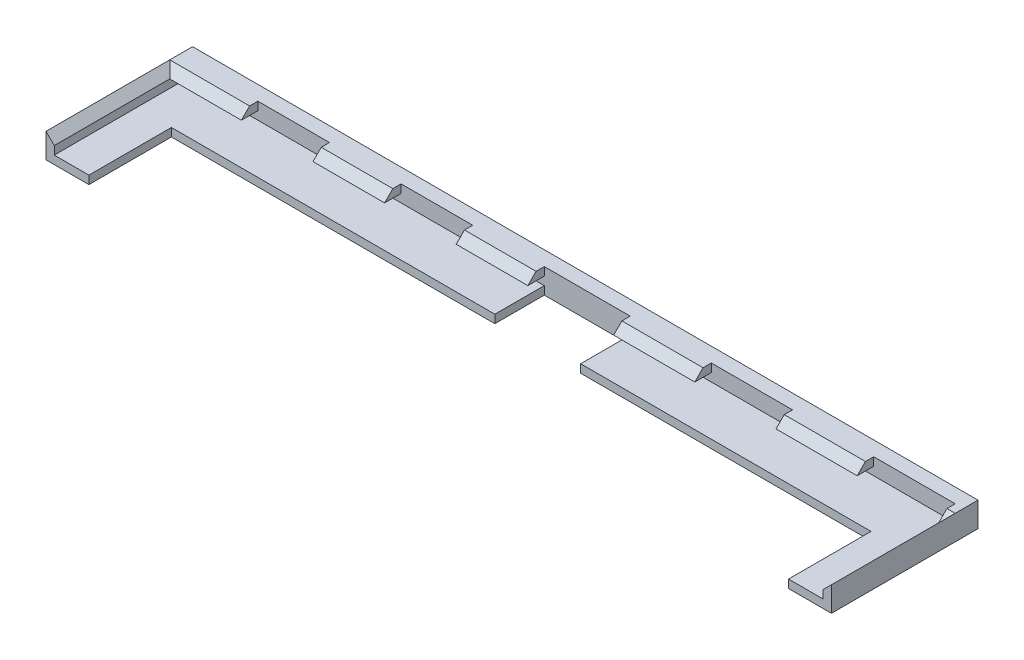
ISO-10303-21;
HEADER;
FILE_DESCRIPTION(('STEP AP214'),'2;1');
FILE_NAME('part.step','',(''),(''),'','','');
FILE_SCHEMA(('AUTOMOTIVE_DESIGN { 1 0 10303 214 1 1 1 1 }'));
ENDSEC;
DATA;
#1=APPLICATION_CONTEXT('core data for automotive mechanical design processes');
#2=APPLICATION_PROTOCOL_DEFINITION('international standard','automotive_design',2000,#1);
#3=PRODUCT_CONTEXT('',#1,'mechanical');
#4=PRODUCT('Part','Part','',(#3));
#5=PRODUCT_RELATED_PRODUCT_CATEGORY('part','',(#4));
#6=PRODUCT_DEFINITION_FORMATION('','',#4);
#7=PRODUCT_DEFINITION_CONTEXT('part definition',#1,'design');
#8=PRODUCT_DEFINITION('design','',#6,#7);
#9=PRODUCT_DEFINITION_SHAPE('','',#8);
#10=(LENGTH_UNIT() NAMED_UNIT(*) SI_UNIT(.MILLI.,.METRE.));
#11=(NAMED_UNIT(*) PLANE_ANGLE_UNIT() SI_UNIT($,.RADIAN.));
#12=(NAMED_UNIT(*) SI_UNIT($,.STERADIAN.) SOLID_ANGLE_UNIT());
#13=UNCERTAINTY_MEASURE_WITH_UNIT(LENGTH_MEASURE(1.E-05),#10,'distance_accuracy_value','');
#14=(GEOMETRIC_REPRESENTATION_CONTEXT(3) GLOBAL_UNCERTAINTY_ASSIGNED_CONTEXT((#13)) GLOBAL_UNIT_ASSIGNED_CONTEXT((#10,
#11,#12)) REPRESENTATION_CONTEXT('',''));
#15=CARTESIAN_POINT('',(0.,0.,0.));
#16=DIRECTION('',(0.,0.,1.));
#17=DIRECTION('',(1.,0.,0.));
#18=AXIS2_PLACEMENT_3D('',#15,#16,#17);
#19=CARTESIAN_POINT('',(21.,2.5,-9.41210666691734));
#20=DIRECTION('',(0.,0.,-1.));
#21=DIRECTION('',(-1.,0.,0.));
#22=AXIS2_PLACEMENT_3D('',#19,#20,#21);
#23=PLANE('',#22);
#24=DIRECTION('',(0.,1.,0.));
#25=VECTOR('',#24,1.);
#26=CARTESIAN_POINT('',(21.,0.,-9.41210666691734));
#27=LINE('',#26,#25);
#28=CARTESIAN_POINT('',(21.,2.5,-9.41210666691734));
#29=VERTEX_POINT('',#28);
#30=CARTESIAN_POINT('',(21.,10.,-9.41210666691734));
#31=VERTEX_POINT('',#30);
#32=EDGE_CURVE('E52',#29,#31,#27,.T.);
#33=ORIENTED_EDGE('',*,*,#32,.T.);
#34=DIRECTION('',(1.,0.,0.));
#35=VECTOR('',#34,1.);
#36=CARTESIAN_POINT('',(0.,10.,-9.41210666691734));
#37=LINE('',#36,#35);
#38=CARTESIAN_POINT('',(259.,10.,-9.41210666691734));
#39=VERTEX_POINT('',#38);
#40=EDGE_CURVE('E46',#31,#39,#37,.T.);
#41=ORIENTED_EDGE('',*,*,#40,.T.);
#42=DIRECTION('',(0.,-1.,0.));
#43=VECTOR('',#42,1.);
#44=CARTESIAN_POINT('',(259.,0.,-9.41210666691734));
#45=LINE('',#44,#43);
#46=CARTESIAN_POINT('',(259.,2.5,-9.41210666691734));
#47=VERTEX_POINT('',#46);
#48=EDGE_CURVE('E552',#39,#47,#45,.T.);
#49=ORIENTED_EDGE('',*,*,#48,.T.);
#50=DIRECTION('',(-1.,0.,0.));
#51=VECTOR('',#50,1.);
#52=CARTESIAN_POINT('',(259.,2.5,-9.41210666691734));
#53=LINE('',#52,#51);
#54=EDGE_CURVE('E11',#47,#29,#53,.T.);
#55=ORIENTED_EDGE('',*,*,#54,.T.);
#56=EDGE_LOOP('',(#33,#41,#49,#55));
#57=FACE_BOUND('',#56,.T.);
#58=ADVANCED_FACE('F43',(#57),#23,.T.);
#59=CARTESIAN_POINT('',(0.,5.,0.));
#60=DIRECTION('',(0.,1.,0.));
#61=DIRECTION('',(0.,0.,1.));
#62=AXIS2_PLACEMENT_3D('',#59,#60,#61);
#63=PLANE('',#62);
#64=DIRECTION('',(0.,0.,1.));
#65=VECTOR('',#64,1.);
#66=CARTESIAN_POINT('',(132.,5.,10.));
#67=LINE('',#66,#65);
#68=CARTESIAN_POINT('',(132.,5.,-5.));
#69=VERTEX_POINT('',#68);
#70=CARTESIAN_POINT('',(132.,5.,10.));
#71=VERTEX_POINT('',#70);
#72=EDGE_CURVE('E510',#69,#71,#67,.T.);
#73=ORIENTED_EDGE('',*,*,#72,.F.);
#74=DIRECTION('',(1.,0.,0.));
#75=VECTOR('',#74,1.);
#76=CARTESIAN_POINT('',(132.,5.,-5.));
#77=LINE('',#76,#75);
#78=CARTESIAN_POINT('',(23.5,5.,-5.));
#79=VERTEX_POINT('',#78);
#80=EDGE_CURVE('E463',#79,#69,#77,.T.);
#81=ORIENTED_EDGE('',*,*,#80,.F.);
#82=DIRECTION('',(0.,0.,1.));
#83=VECTOR('',#82,1.);
#84=CARTESIAN_POINT('',(23.5,5.,35.));
#85=LINE('',#84,#83);
#86=CARTESIAN_POINT('',(23.5,5.,35.));
#87=VERTEX_POINT('',#86);
#88=EDGE_CURVE('E516',#79,#87,#85,.T.);
#89=ORIENTED_EDGE('',*,*,#88,.T.);
#90=DIRECTION('',(-1.,0.,0.));
#91=VECTOR('',#90,1.);
#92=CARTESIAN_POINT('',(0.,5.,35.));
#93=LINE('',#92,#91);
#94=CARTESIAN_POINT('',(34.,5.,35.));
#95=VERTEX_POINT('',#94);
#96=EDGE_CURVE('E488',#95,#87,#93,.T.);
#97=ORIENTED_EDGE('',*,*,#96,.F.);
#98=DIRECTION('',(0.,0.,1.));
#99=VECTOR('',#98,1.);
#100=CARTESIAN_POINT('',(34.,5.,55.));
#101=LINE('',#100,#99);
#102=CARTESIAN_POINT('',(34.,5.,10.));
#103=VERTEX_POINT('',#102);
#104=EDGE_CURVE('E449',#103,#95,#101,.T.);
#105=ORIENTED_EDGE('',*,*,#104,.F.);
#106=DIRECTION('',(-1.,0.,0.));
#107=VECTOR('',#106,1.);
#108=CARTESIAN_POINT('',(34.,5.,10.));
#109=LINE('',#108,#107);
#110=EDGE_CURVE('E445',#71,#103,#109,.T.);
#111=ORIENTED_EDGE('',*,*,#110,.F.);
#112=EDGE_LOOP('',(#73,#81,#89,#97,#105,#111));
#113=FACE_BOUND('',#112,.T.);
#114=ADVANCED_FACE('F608',(#113),#63,.T.);
#115=CARTESIAN_POINT('',(23.5,5.,35.));
#116=DIRECTION('',(-1.,0.,0.));
#117=DIRECTION('',(0.,0.,1.));
#118=AXIS2_PLACEMENT_3D('',#115,#116,#117);
#119=PLANE('',#118);
#120=DIRECTION('',(0.,0.,1.));
#121=VECTOR('',#120,1.);
#122=CARTESIAN_POINT('',(23.5,7.5,-5.));
#123=LINE('',#122,#121);
#124=CARTESIAN_POINT('',(23.5,7.5,-5.));
#125=VERTEX_POINT('',#124);
#126=CARTESIAN_POINT('',(23.5,7.5,0.));
#127=VERTEX_POINT('',#126);
#128=EDGE_CURVE('E524',#125,#127,#123,.T.);
#129=ORIENTED_EDGE('',*,*,#128,.T.);
#130=DIRECTION('',(0.,0.,1.));
#131=VECTOR('',#130,1.);
#132=CARTESIAN_POINT('',(23.5,7.49999999999997,35.));
#133=LINE('',#132,#131);
#134=CARTESIAN_POINT('',(23.5,7.49999999999997,35.));
#135=VERTEX_POINT('',#134);
#136=EDGE_CURVE('E410',#127,#135,#133,.T.);
#137=ORIENTED_EDGE('',*,*,#136,.T.);
#138=DIRECTION('',(0.,1.,0.));
#139=VECTOR('',#138,1.);
#140=CARTESIAN_POINT('',(23.5,5.,35.));
#141=LINE('',#140,#139);
#142=EDGE_CURVE('E513',#87,#135,#141,.T.);
#143=ORIENTED_EDGE('',*,*,#142,.F.);
#144=ORIENTED_EDGE('',*,*,#88,.F.);
#145=DIRECTION('',(0.,-1.,0.));
#146=VECTOR('',#145,1.);
#147=CARTESIAN_POINT('',(23.5,5.,-5.));
#148=LINE('',#147,#146);
#149=EDGE_CURVE('E527',#125,#79,#148,.T.);
#150=ORIENTED_EDGE('',*,*,#149,.F.);
#151=EDGE_LOOP('',(#129,#137,#143,#144,#150));
#152=FACE_BOUND('',#151,.T.);
#153=ADVANCED_FACE('F613',(#152),#119,.F.);
#154=CARTESIAN_POINT('',(25.,7.5,-5.));
#155=DIRECTION('',(0.,1.,0.));
#156=DIRECTION('',(0.,0.,1.));
#157=AXIS2_PLACEMENT_3D('',#154,#155,#156);
#158=PLANE('',#157);
#159=DIRECTION('',(-1.,0.,0.));
#160=VECTOR('',#159,1.);
#161=CARTESIAN_POINT('',(25.,7.5,-5.));
#162=LINE('',#161,#160);
#163=CARTESIAN_POINT('',(45.2,7.5,-5.));
#164=VERTEX_POINT('',#163);
#165=EDGE_CURVE('E472',#164,#125,#162,.T.);
#166=ORIENTED_EDGE('',*,*,#165,.F.);
#167=DIRECTION('',(0.,0.,1.));
#168=VECTOR('',#167,1.);
#169=CARTESIAN_POINT('',(45.2,7.5,-5.));
#170=LINE('',#169,#168);
#171=CARTESIAN_POINT('',(45.2,7.49999999999998,0.));
#172=VERTEX_POINT('',#171);
#173=EDGE_CURVE('E369',#164,#172,#170,.T.);
#174=ORIENTED_EDGE('',*,*,#173,.T.);
#175=DIRECTION('',(-1.,0.,0.));
#176=VECTOR('',#175,1.);
#177=CARTESIAN_POINT('',(25.,7.5,0.));
#178=LINE('',#177,#176);
#179=EDGE_CURVE('E478',#172,#127,#178,.T.);
#180=ORIENTED_EDGE('',*,*,#179,.T.);
#181=ORIENTED_EDGE('',*,*,#128,.F.);
#182=EDGE_LOOP('',(#166,#174,#180,#181));
#183=FACE_BOUND('',#182,.T.);
#184=ADVANCED_FACE('F632',(#183),#158,.F.);
#185=CARTESIAN_POINT('',(88.6,7.5,-5.));
#186=VERTEX_POINT('',#185);
#187=CARTESIAN_POINT('',(66.9,7.5,-5.));
#188=VERTEX_POINT('',#187);
#189=EDGE_CURVE('E482',#186,#188,#162,.T.);
#190=ORIENTED_EDGE('',*,*,#189,.F.);
#191=DIRECTION('',(0.,0.,1.));
#192=VECTOR('',#191,1.);
#193=CARTESIAN_POINT('',(88.6,7.5,-5.));
#194=LINE('',#193,#192);
#195=CARTESIAN_POINT('',(88.6,7.49999999999997,0.));
#196=VERTEX_POINT('',#195);
#197=EDGE_CURVE('E353',#186,#196,#194,.T.);
#198=ORIENTED_EDGE('',*,*,#197,.T.);
#199=CARTESIAN_POINT('',(66.9,7.49999999999998,0.));
#200=VERTEX_POINT('',#199);
#201=EDGE_CURVE('E477',#196,#200,#178,.T.);
#202=ORIENTED_EDGE('',*,*,#201,.T.);
#203=DIRECTION('',(0.,0.,-1.));
#204=VECTOR('',#203,1.);
#205=CARTESIAN_POINT('',(66.9,7.5,-5.));
#206=LINE('',#205,#204);
#207=EDGE_CURVE('E364',#200,#188,#206,.T.);
#208=ORIENTED_EDGE('',*,*,#207,.T.);
#209=EDGE_LOOP('',(#190,#198,#202,#208));
#210=FACE_BOUND('',#209,.T.);
#211=ADVANCED_FACE('F642',(#210),#158,.F.);
#212=CARTESIAN_POINT('',(132.,7.5,0.));
#213=VERTEX_POINT('',#212);
#214=CARTESIAN_POINT('',(110.3,7.49999999999997,0.));
#215=VERTEX_POINT('',#214);
#216=EDGE_CURVE('E473',#213,#215,#178,.T.);
#217=ORIENTED_EDGE('',*,*,#216,.T.);
#218=DIRECTION('',(0.,0.,-1.));
#219=VECTOR('',#218,1.);
#220=CARTESIAN_POINT('',(110.3,7.5,-5.));
#221=LINE('',#220,#219);
#222=CARTESIAN_POINT('',(110.3,7.5,-5.));
#223=VERTEX_POINT('',#222);
#224=EDGE_CURVE('E348',#215,#223,#221,.T.);
#225=ORIENTED_EDGE('',*,*,#224,.T.);
#226=CARTESIAN_POINT('',(132.,7.5,-5.));
#227=VERTEX_POINT('',#226);
#228=EDGE_CURVE('E479',#227,#223,#162,.T.);
#229=ORIENTED_EDGE('',*,*,#228,.F.);
#230=DIRECTION('',(0.,0.,1.));
#231=VECTOR('',#230,1.);
#232=CARTESIAN_POINT('',(132.,7.5,-5.));
#233=LINE('',#232,#231);
#234=EDGE_CURVE('E469',#227,#213,#233,.T.);
#235=ORIENTED_EDGE('',*,*,#234,.T.);
#236=EDGE_LOOP('',(#217,#225,#229,#235));
#237=FACE_BOUND('',#236,.T.);
#238=ADVANCED_FACE('F750',(#237),#158,.F.);
#239=CARTESIAN_POINT('',(158.,7.5,-5.));
#240=DIRECTION('',(0.,1.,0.));
#241=DIRECTION('',(0.,0.,1.));
#242=AXIS2_PLACEMENT_3D('',#239,#240,#241);
#243=PLANE('',#242);
#244=DIRECTION('',(-1.,0.,0.));
#245=VECTOR('',#244,1.);
#246=CARTESIAN_POINT('',(158.,7.5,-5.));
#247=LINE('',#246,#245);
#248=CARTESIAN_POINT('',(182.6,7.5,-5.));
#249=VERTEX_POINT('',#248);
#250=CARTESIAN_POINT('',(158.,7.5,-5.));
#251=VERTEX_POINT('',#250);
#252=EDGE_CURVE('E485',#249,#251,#247,.T.);
#253=ORIENTED_EDGE('',*,*,#252,.F.);
#254=DIRECTION('',(0.,0.,1.));
#255=VECTOR('',#254,1.);
#256=CARTESIAN_POINT('',(182.6,7.5,-5.));
#257=LINE('',#256,#255);
#258=CARTESIAN_POINT('',(182.6,7.5,0.));
#259=VERTEX_POINT('',#258);
#260=EDGE_CURVE('E333',#249,#259,#257,.T.);
#261=ORIENTED_EDGE('',*,*,#260,.T.);
#262=DIRECTION('',(-1.,0.,0.));
#263=VECTOR('',#262,1.);
#264=CARTESIAN_POINT('',(158.,7.5,0.));
#265=LINE('',#264,#263);
#266=CARTESIAN_POINT('',(158.,7.5,0.));
#267=VERTEX_POINT('',#266);
#268=EDGE_CURVE('E489',#259,#267,#265,.T.);
#269=ORIENTED_EDGE('',*,*,#268,.T.);
#270=DIRECTION('',(0.,0.,1.));
#271=VECTOR('',#270,1.);
#272=CARTESIAN_POINT('',(158.,7.5,-5.));
#273=LINE('',#272,#271);
#274=EDGE_CURVE('E476',#251,#267,#273,.T.);
#275=ORIENTED_EDGE('',*,*,#274,.F.);
#276=EDGE_LOOP('',(#253,#261,#269,#275));
#277=FACE_BOUND('',#276,.T.);
#278=ADVANCED_FACE('F677',(#277),#243,.F.);
#279=CARTESIAN_POINT('',(231.8,7.5,-5.));
#280=VERTEX_POINT('',#279);
#281=CARTESIAN_POINT('',(207.2,7.5,-5.));
#282=VERTEX_POINT('',#281);
#283=EDGE_CURVE('E490',#280,#282,#247,.T.);
#284=ORIENTED_EDGE('',*,*,#283,.F.);
#285=DIRECTION('',(0.,0.,1.));
#286=VECTOR('',#285,1.);
#287=CARTESIAN_POINT('',(231.8,7.5,-5.));
#288=LINE('',#287,#286);
#289=CARTESIAN_POINT('',(231.8,7.49999999999999,0.));
#290=VERTEX_POINT('',#289);
#291=EDGE_CURVE('E289',#280,#290,#288,.T.);
#292=ORIENTED_EDGE('',*,*,#291,.T.);
#293=CARTESIAN_POINT('',(207.2,7.5,0.));
#294=VERTEX_POINT('',#293);
#295=EDGE_CURVE('E486',#290,#294,#265,.T.);
#296=ORIENTED_EDGE('',*,*,#295,.T.);
#297=DIRECTION('',(0.,0.,-1.));
#298=VECTOR('',#297,1.);
#299=CARTESIAN_POINT('',(207.2,7.5,-5.));
#300=LINE('',#299,#298);
#301=EDGE_CURVE('E328',#294,#282,#300,.T.);
#302=ORIENTED_EDGE('',*,*,#301,.T.);
#303=EDGE_LOOP('',(#284,#292,#296,#302));
#304=FACE_BOUND('',#303,.T.);
#305=ADVANCED_FACE('F687',(#304),#243,.F.);
#306=DIRECTION('',(0.,0.,-1.));
#307=VECTOR('',#306,1.);
#308=CARTESIAN_POINT('',(256.5,5.,35.));
#309=LINE('',#308,#307);
#310=CARTESIAN_POINT('',(256.5,5.,35.));
#311=VERTEX_POINT('',#310);
#312=CARTESIAN_POINT('',(256.5,5.,-5.));
#313=VERTEX_POINT('',#312);
#314=EDGE_CURVE('E522',#311,#313,#309,.T.);
#315=ORIENTED_EDGE('',*,*,#314,.T.);
#316=CARTESIAN_POINT('',(158.,5.,-5.));
#317=VERTEX_POINT('',#316);
#318=EDGE_CURVE('E465',#317,#313,#77,.T.);
#319=ORIENTED_EDGE('',*,*,#318,.F.);
#320=DIRECTION('',(0.,0.,-1.));
#321=VECTOR('',#320,1.);
#322=CARTESIAN_POINT('',(158.,5.,10.));
#323=LINE('',#322,#321);
#324=CARTESIAN_POINT('',(158.,5.,10.));
#325=VERTEX_POINT('',#324);
#326=EDGE_CURVE('E501',#325,#317,#323,.T.);
#327=ORIENTED_EDGE('',*,*,#326,.F.);
#328=CARTESIAN_POINT('',(246.,5.,10.));
#329=VERTEX_POINT('',#328);
#330=EDGE_CURVE('E441',#329,#325,#109,.T.);
#331=ORIENTED_EDGE('',*,*,#330,.F.);
#332=DIRECTION('',(0.,0.,-1.));
#333=VECTOR('',#332,1.);
#334=CARTESIAN_POINT('',(246.,5.,55.));
#335=LINE('',#334,#333);
#336=CARTESIAN_POINT('',(246.,5.,35.));
#337=VERTEX_POINT('',#336);
#338=EDGE_CURVE('E446',#337,#329,#335,.T.);
#339=ORIENTED_EDGE('',*,*,#338,.F.);
#340=EDGE_CURVE('E495',#311,#337,#93,.T.);
#341=ORIENTED_EDGE('',*,*,#340,.F.);
#342=EDGE_LOOP('',(#315,#319,#327,#331,#339,#341));
#343=FACE_BOUND('',#342,.T.);
#344=ADVANCED_FACE('F704',(#343),#63,.T.);
#345=CARTESIAN_POINT('',(0.,10.,-2.5));
#346=DIRECTION('',(0.,-0.707106781186547,-0.707106781186547));
#347=DIRECTION('',(1.,0.,0.));
#348=AXIS2_PLACEMENT_3D('',#345,#346,#347);
#349=PLANE('',#348);
#350=DIRECTION('',(0.,-0.707106781186548,0.707106781186548));
#351=VECTOR('',#350,1.);
#352=CARTESIAN_POINT('',(256.5,10.,-2.5));
#353=LINE('',#352,#351);
#354=CARTESIAN_POINT('',(256.5,7.5,0.));
#355=VERTEX_POINT('',#354);
#356=CARTESIAN_POINT('',(256.5,10.,-2.5));
#357=VERTEX_POINT('',#356);
#358=EDGE_CURVE('E314',#355,#357,#353,.F.);
#359=ORIENTED_EDGE('',*,*,#358,.F.);
#360=DIRECTION('',(0.577350269189626,0.577350269189626,-0.577350269189626));
#361=VECTOR('',#360,1.);
#362=CARTESIAN_POINT('',(244.833333333333,-4.16666666666667,11.6666666666667));
#363=LINE('',#362,#361);
#364=CARTESIAN_POINT('',(259.,10.,-2.5));
#365=VERTEX_POINT('',#364);
#366=EDGE_CURVE('E405',#365,#355,#363,.F.);
#367=ORIENTED_EDGE('',*,*,#366,.F.);
#368=DIRECTION('',(1.,0.,0.));
#369=VECTOR('',#368,1.);
#370=CARTESIAN_POINT('',(0.,10.,-2.5));
#371=LINE('',#370,#369);
#372=EDGE_CURVE('E421',#357,#365,#371,.T.);
#373=ORIENTED_EDGE('',*,*,#372,.F.);
#374=EDGE_LOOP('',(#359,#367,#373));
#375=FACE_BOUND('',#374,.T.);
#376=ADVANCED_FACE('F565',(#375),#349,.F.);
#377=CARTESIAN_POINT('',(256.5,5.,35.));
#378=DIRECTION('',(1.,0.,0.));
#379=DIRECTION('',(0.,0.,-1.));
#380=AXIS2_PLACEMENT_3D('',#377,#378,#379);
#381=PLANE('',#380);
#382=DIRECTION('',(0.,0.,-1.));
#383=VECTOR('',#382,1.);
#384=CARTESIAN_POINT('',(256.5,7.5,35.));
#385=LINE('',#384,#383);
#386=CARTESIAN_POINT('',(256.5,7.5,35.));
#387=VERTEX_POINT('',#386);
#388=EDGE_CURVE('E433',#387,#355,#385,.T.);
#389=ORIENTED_EDGE('',*,*,#388,.T.);
#390=ORIENTED_EDGE('',*,*,#358,.T.);
#391=DIRECTION('',(0.,0.,1.));
#392=VECTOR('',#391,1.);
#393=CARTESIAN_POINT('',(256.5,10.,0.));
#394=LINE('',#393,#392);
#395=CARTESIAN_POINT('',(256.5,10.,-5.));
#396=VERTEX_POINT('',#395);
#397=EDGE_CURVE('E549',#396,#357,#394,.T.);
#398=ORIENTED_EDGE('',*,*,#397,.F.);
#399=DIRECTION('',(0.,1.,0.));
#400=VECTOR('',#399,1.);
#401=CARTESIAN_POINT('',(256.5,5.,-5.));
#402=LINE('',#401,#400);
#403=EDGE_CURVE('E299',#313,#396,#402,.T.);
#404=ORIENTED_EDGE('',*,*,#403,.F.);
#405=ORIENTED_EDGE('',*,*,#314,.F.);
#406=DIRECTION('',(0.,1.,0.));
#407=VECTOR('',#406,1.);
#408=CARTESIAN_POINT('',(256.5,5.,35.));
#409=LINE('',#408,#407);
#410=EDGE_CURVE('E519',#311,#387,#409,.T.);
#411=ORIENTED_EDGE('',*,*,#410,.T.);
#412=EDGE_LOOP('',(#389,#390,#398,#404,#405,#411));
#413=FACE_BOUND('',#412,.T.);
#414=ADVANCED_FACE('F567',(#413),#381,.F.);
#415=CARTESIAN_POINT('',(231.8,-20.2009920439652,0.));
#416=DIRECTION('',(-1.,0.,0.));
#417=DIRECTION('',(0.,0.,1.));
#418=AXIS2_PLACEMENT_3D('',#415,#416,#417);
#419=PLANE('',#418);
#420=DIRECTION('',(0.,1.,0.));
#421=VECTOR('',#420,1.);
#422=CARTESIAN_POINT('',(231.8,-20.2009920439652,-5.));
#423=LINE('',#422,#421);
#424=CARTESIAN_POINT('',(231.8,10.,-5.));
#425=VERTEX_POINT('',#424);
#426=EDGE_CURVE('E282',#280,#425,#423,.T.);
#427=ORIENTED_EDGE('',*,*,#426,.T.);
#428=DIRECTION('',(0.,0.,1.));
#429=VECTOR('',#428,1.);
#430=CARTESIAN_POINT('',(231.8,10.,0.));
#431=LINE('',#430,#429);
#432=CARTESIAN_POINT('',(231.8,10.,-2.5));
#433=VERTEX_POINT('',#432);
#434=EDGE_CURVE('E286',#425,#433,#431,.T.);
#435=ORIENTED_EDGE('',*,*,#434,.T.);
#436=DIRECTION('',(0.,0.707106781186548,-0.707106781186548));
#437=VECTOR('',#436,1.);
#438=CARTESIAN_POINT('',(231.8,10.,-2.5));
#439=LINE('',#438,#437);
#440=EDGE_CURVE('E292',#433,#290,#439,.F.);
#441=ORIENTED_EDGE('',*,*,#440,.T.);
#442=ORIENTED_EDGE('',*,*,#291,.F.);
#443=EDGE_LOOP('',(#427,#435,#441,#442));
#444=FACE_BOUND('',#443,.T.);
#445=ADVANCED_FACE('F284',(#444),#419,.F.);
#446=ORIENTED_EDGE('',*,*,#440,.F.);
#447=CARTESIAN_POINT('',(207.2,10.,-2.5));
#448=VERTEX_POINT('',#447);
#449=EDGE_CURVE('E309',#448,#433,#371,.T.);
#450=ORIENTED_EDGE('',*,*,#449,.F.);
#451=DIRECTION('',(0.,-0.707106781186548,0.707106781186548));
#452=VECTOR('',#451,1.);
#453=CARTESIAN_POINT('',(207.2,10.,-2.5));
#454=LINE('',#453,#452);
#455=EDGE_CURVE('E324',#294,#448,#454,.F.);
#456=ORIENTED_EDGE('',*,*,#455,.F.);
#457=ORIENTED_EDGE('',*,*,#295,.F.);
#458=EDGE_LOOP('',(#446,#450,#456,#457));
#459=FACE_BOUND('',#458,.T.);
#460=ADVANCED_FACE('F684',(#459),#349,.F.);
#461=CARTESIAN_POINT('',(207.2,-20.1029878699728,0.));
#462=DIRECTION('',(1.,0.,0.));
#463=DIRECTION('',(0.,0.,-1.));
#464=AXIS2_PLACEMENT_3D('',#461,#462,#463);
#465=PLANE('',#464);
#466=ORIENTED_EDGE('',*,*,#455,.T.);
#467=DIRECTION('',(0.,0.,1.));
#468=VECTOR('',#467,1.);
#469=CARTESIAN_POINT('',(207.2,10.,0.));
#470=LINE('',#469,#468);
#471=CARTESIAN_POINT('',(207.2,10.,-5.));
#472=VERTEX_POINT('',#471);
#473=EDGE_CURVE('E547',#472,#448,#470,.T.);
#474=ORIENTED_EDGE('',*,*,#473,.F.);
#475=DIRECTION('',(0.,1.,0.));
#476=VECTOR('',#475,1.);
#477=CARTESIAN_POINT('',(207.2,-20.1029878699728,-5.));
#478=LINE('',#477,#476);
#479=EDGE_CURVE('E321',#282,#472,#478,.T.);
#480=ORIENTED_EDGE('',*,*,#479,.F.);
#481=ORIENTED_EDGE('',*,*,#301,.F.);
#482=EDGE_LOOP('',(#466,#474,#480,#481));
#483=FACE_BOUND('',#482,.T.);
#484=ADVANCED_FACE('F689',(#483),#465,.F.);
#485=CARTESIAN_POINT('',(182.6,-20.1029878699728,0.));
#486=DIRECTION('',(-1.,0.,0.));
#487=DIRECTION('',(0.,0.,1.));
#488=AXIS2_PLACEMENT_3D('',#485,#486,#487);
#489=PLANE('',#488);
#490=DIRECTION('',(0.,1.,0.));
#491=VECTOR('',#490,1.);
#492=CARTESIAN_POINT('',(182.6,-20.1029878699728,-5.));
#493=LINE('',#492,#491);
#494=CARTESIAN_POINT('',(182.6,10.,-5.));
#495=VERTEX_POINT('',#494);
#496=EDGE_CURVE('E322',#249,#495,#493,.T.);
#497=ORIENTED_EDGE('',*,*,#496,.T.);
#498=DIRECTION('',(0.,0.,1.));
#499=VECTOR('',#498,1.);
#500=CARTESIAN_POINT('',(182.6,10.,0.));
#501=LINE('',#500,#499);
#502=CARTESIAN_POINT('',(182.6,10.,-2.5));
#503=VERTEX_POINT('',#502);
#504=EDGE_CURVE('E316',#495,#503,#501,.T.);
#505=ORIENTED_EDGE('',*,*,#504,.T.);
#506=DIRECTION('',(0.,0.707106781186548,-0.707106781186548));
#507=VECTOR('',#506,1.);
#508=CARTESIAN_POINT('',(182.6,10.,-2.5));
#509=LINE('',#508,#507);
#510=EDGE_CURVE('E331',#503,#259,#509,.F.);
#511=ORIENTED_EDGE('',*,*,#510,.T.);
#512=ORIENTED_EDGE('',*,*,#260,.F.);
#513=EDGE_LOOP('',(#497,#505,#511,#512));
#514=FACE_BOUND('',#513,.T.);
#515=ADVANCED_FACE('F673',(#514),#489,.F.);
#516=ORIENTED_EDGE('',*,*,#510,.F.);
#517=CARTESIAN_POINT('',(158.,10.,-2.5));
#518=VERTEX_POINT('',#517);
#519=EDGE_CURVE('E422',#518,#503,#371,.T.);
#520=ORIENTED_EDGE('',*,*,#519,.F.);
#521=DIRECTION('',(0.,-0.707106781186548,0.707106781186548));
#522=VECTOR('',#521,1.);
#523=CARTESIAN_POINT('',(158.,10.,-2.5));
#524=LINE('',#523,#522);
#525=EDGE_CURVE('E414',#267,#518,#524,.F.);
#526=ORIENTED_EDGE('',*,*,#525,.F.);
#527=ORIENTED_EDGE('',*,*,#268,.F.);
#528=EDGE_LOOP('',(#516,#520,#526,#527));
#529=FACE_BOUND('',#528,.T.);
#530=ADVANCED_FACE('F670',(#529),#349,.F.);
#531=CARTESIAN_POINT('',(158.,10.,-5.));
#532=DIRECTION('',(1.,0.,0.));
#533=DIRECTION('',(0.,0.,-1.));
#534=AXIS2_PLACEMENT_3D('',#531,#532,#533);
#535=PLANE('',#534);
#536=ORIENTED_EDGE('',*,*,#274,.T.);
#537=ORIENTED_EDGE('',*,*,#525,.T.);
#538=DIRECTION('',(0.,0.,1.));
#539=VECTOR('',#538,1.);
#540=CARTESIAN_POINT('',(158.,10.,-5.));
#541=LINE('',#540,#539);
#542=CARTESIAN_POINT('',(158.,10.,-5.));
#543=VERTEX_POINT('',#542);
#544=EDGE_CURVE('E453',#543,#518,#541,.T.);
#545=ORIENTED_EDGE('',*,*,#544,.F.);
#546=DIRECTION('',(0.,1.,0.));
#547=VECTOR('',#546,1.);
#548=CARTESIAN_POINT('',(158.,10.,-5.));
#549=LINE('',#548,#547);
#550=EDGE_CURVE('E461',#251,#543,#549,.T.);
#551=ORIENTED_EDGE('',*,*,#550,.F.);
#552=EDGE_LOOP('',(#536,#537,#545,#551));
#553=FACE_BOUND('',#552,.T.);
#554=ADVANCED_FACE('F745',(#553),#535,.F.);
#555=CARTESIAN_POINT('',(132.,10.,-5.));
#556=DIRECTION('',(-1.,0.,0.));
#557=DIRECTION('',(0.,0.,1.));
#558=AXIS2_PLACEMENT_3D('',#555,#556,#557);
#559=PLANE('',#558);
#560=DIRECTION('',(0.,0.,1.));
#561=VECTOR('',#560,1.);
#562=CARTESIAN_POINT('',(132.,10.,-5.));
#563=LINE('',#562,#561);
#564=CARTESIAN_POINT('',(132.,10.,-5.));
#565=VERTEX_POINT('',#564);
#566=CARTESIAN_POINT('',(132.,10.,-2.50000000000003));
#567=VERTEX_POINT('',#566);
#568=EDGE_CURVE('E452',#565,#567,#563,.T.);
#569=ORIENTED_EDGE('',*,*,#568,.T.);
#570=DIRECTION('',(0.,0.707106781186548,-0.707106781186548));
#571=VECTOR('',#570,1.);
#572=CARTESIAN_POINT('',(132.,10.,-2.50000000000003));
#573=LINE('',#572,#571);
#574=EDGE_CURVE('E412',#567,#213,#573,.F.);
#575=ORIENTED_EDGE('',*,*,#574,.T.);
#576=ORIENTED_EDGE('',*,*,#234,.F.);
#577=DIRECTION('',(0.,-1.,0.));
#578=VECTOR('',#577,1.);
#579=CARTESIAN_POINT('',(132.,10.,-5.));
#580=LINE('',#579,#578);
#581=EDGE_CURVE('E466',#565,#227,#580,.T.);
#582=ORIENTED_EDGE('',*,*,#581,.F.);
#583=EDGE_LOOP('',(#569,#575,#576,#582));
#584=FACE_BOUND('',#583,.T.);
#585=ADVANCED_FACE('F661',(#584),#559,.F.);
#586=CARTESIAN_POINT('',(0.,10.,-2.50000000000003));
#587=DIRECTION('',(0.,-0.707106781186547,-0.707106781186547));
#588=DIRECTION('',(1.,0.,0.));
#589=AXIS2_PLACEMENT_3D('',#586,#587,#588);
#590=PLANE('',#589);
#591=DIRECTION('',(0.,-0.707106781186548,0.707106781186548));
#592=VECTOR('',#591,1.);
#593=CARTESIAN_POINT('',(110.3,10.,-2.50000000000003));
#594=LINE('',#593,#592);
#595=CARTESIAN_POINT('',(110.3,10.,-2.50000000000003));
#596=VERTEX_POINT('',#595);
#597=EDGE_CURVE('E344',#215,#596,#594,.F.);
#598=ORIENTED_EDGE('',*,*,#597,.F.);
#599=ORIENTED_EDGE('',*,*,#216,.F.);
#600=ORIENTED_EDGE('',*,*,#574,.F.);
#601=DIRECTION('',(1.,0.,0.));
#602=VECTOR('',#601,1.);
#603=CARTESIAN_POINT('',(0.,10.,-2.50000000000003));
#604=LINE('',#603,#602);
#605=EDGE_CURVE('E425',#596,#567,#604,.T.);
#606=ORIENTED_EDGE('',*,*,#605,.F.);
#607=EDGE_LOOP('',(#598,#599,#600,#606));
#608=FACE_BOUND('',#607,.T.);
#609=ADVANCED_FACE('F658',(#608),#590,.F.);
#610=CARTESIAN_POINT('',(110.3,-17.2685877414801,0.));
#611=DIRECTION('',(1.,0.,0.));
#612=DIRECTION('',(0.,0.,-1.));
#613=AXIS2_PLACEMENT_3D('',#610,#611,#612);
#614=PLANE('',#613);
#615=ORIENTED_EDGE('',*,*,#597,.T.);
#616=DIRECTION('',(0.,0.,1.));
#617=VECTOR('',#616,1.);
#618=CARTESIAN_POINT('',(110.3,10.,0.));
#619=LINE('',#618,#617);
#620=CARTESIAN_POINT('',(110.3,10.,-5.));
#621=VERTEX_POINT('',#620);
#622=EDGE_CURVE('E544',#621,#596,#619,.T.);
#623=ORIENTED_EDGE('',*,*,#622,.F.);
#624=DIRECTION('',(0.,1.,0.));
#625=VECTOR('',#624,1.);
#626=CARTESIAN_POINT('',(110.3,-17.2685877414801,-5.));
#627=LINE('',#626,#625);
#628=EDGE_CURVE('E341',#223,#621,#627,.T.);
#629=ORIENTED_EDGE('',*,*,#628,.F.);
#630=ORIENTED_EDGE('',*,*,#224,.F.);
#631=EDGE_LOOP('',(#615,#623,#629,#630));
#632=FACE_BOUND('',#631,.T.);
#633=ADVANCED_FACE('F726',(#632),#614,.F.);
#634=CARTESIAN_POINT('',(88.6,-17.2685877414801,0.));
#635=DIRECTION('',(-1.,0.,0.));
#636=DIRECTION('',(0.,0.,1.));
#637=AXIS2_PLACEMENT_3D('',#634,#635,#636);
#638=PLANE('',#637);
#639=DIRECTION('',(0.,1.,0.));
#640=VECTOR('',#639,1.);
#641=CARTESIAN_POINT('',(88.6,-17.2685877414801,-5.));
#642=LINE('',#641,#640);
#643=CARTESIAN_POINT('',(88.6,10.,-5.));
#644=VERTEX_POINT('',#643);
#645=EDGE_CURVE('E342',#186,#644,#642,.T.);
#646=ORIENTED_EDGE('',*,*,#645,.T.);
#647=DIRECTION('',(0.,0.,1.));
#648=VECTOR('',#647,1.);
#649=CARTESIAN_POINT('',(88.6,10.,0.));
#650=LINE('',#649,#648);
#651=CARTESIAN_POINT('',(88.6,10.,-2.5));
#652=VERTEX_POINT('',#651);
#653=EDGE_CURVE('E336',#644,#652,#650,.T.);
#654=ORIENTED_EDGE('',*,*,#653,.T.);
#655=DIRECTION('',(0.,0.707106781186548,-0.707106781186548));
#656=VECTOR('',#655,1.);
#657=CARTESIAN_POINT('',(88.6,10.,-2.50000000000003));
#658=LINE('',#657,#656);
#659=EDGE_CURVE('E351',#652,#196,#658,.F.);
#660=ORIENTED_EDGE('',*,*,#659,.T.);
#661=ORIENTED_EDGE('',*,*,#197,.F.);
#662=EDGE_LOOP('',(#646,#654,#660,#661));
#663=FACE_BOUND('',#662,.T.);
#664=ADVANCED_FACE('F979',(#663),#638,.F.);
#665=ORIENTED_EDGE('',*,*,#659,.F.);
#666=CARTESIAN_POINT('',(66.9,10.,-2.50000000000003));
#667=VERTEX_POINT('',#666);
#668=EDGE_CURVE('E430',#667,#652,#604,.T.);
#669=ORIENTED_EDGE('',*,*,#668,.F.);
#670=DIRECTION('',(0.,-0.707106781186548,0.707106781186548));
#671=VECTOR('',#670,1.);
#672=CARTESIAN_POINT('',(66.9,10.,-2.50000000000003));
#673=LINE('',#672,#671);
#674=EDGE_CURVE('E360',#200,#667,#673,.F.);
#675=ORIENTED_EDGE('',*,*,#674,.F.);
#676=ORIENTED_EDGE('',*,*,#201,.F.);
#677=EDGE_LOOP('',(#665,#669,#675,#676));
#678=FACE_BOUND('',#677,.T.);
#679=ADVANCED_FACE('F646',(#678),#590,.F.);
#680=CARTESIAN_POINT('',(66.9,-17.2685877414801,0.));
#681=DIRECTION('',(1.,0.,0.));
#682=DIRECTION('',(0.,0.,-1.));
#683=AXIS2_PLACEMENT_3D('',#680,#681,#682);
#684=PLANE('',#683);
#685=ORIENTED_EDGE('',*,*,#674,.T.);
#686=DIRECTION('',(0.,0.,1.));
#687=VECTOR('',#686,1.);
#688=CARTESIAN_POINT('',(66.9,10.,0.));
#689=LINE('',#688,#687);
#690=CARTESIAN_POINT('',(66.9,10.,-5.));
#691=VERTEX_POINT('',#690);
#692=EDGE_CURVE('E535',#691,#667,#689,.T.);
#693=ORIENTED_EDGE('',*,*,#692,.F.);
#694=DIRECTION('',(0.,1.,0.));
#695=VECTOR('',#694,1.);
#696=CARTESIAN_POINT('',(66.9,-17.2685877414801,-5.));
#697=LINE('',#696,#695);
#698=EDGE_CURVE('E356',#188,#691,#697,.T.);
#699=ORIENTED_EDGE('',*,*,#698,.F.);
#700=ORIENTED_EDGE('',*,*,#207,.F.);
#701=EDGE_LOOP('',(#685,#693,#699,#700));
#702=FACE_BOUND('',#701,.T.);
#703=ADVANCED_FACE('F640',(#702),#684,.F.);
#704=CARTESIAN_POINT('',(45.2,-17.2685877414801,0.));
#705=DIRECTION('',(-1.,0.,0.));
#706=DIRECTION('',(0.,0.,1.));
#707=AXIS2_PLACEMENT_3D('',#704,#705,#706);
#708=PLANE('',#707);
#709=DIRECTION('',(0.,1.,0.));
#710=VECTOR('',#709,1.);
#711=CARTESIAN_POINT('',(45.2,-17.2685877414801,-5.));
#712=LINE('',#711,#710);
#713=CARTESIAN_POINT('',(45.2,10.,-5.));
#714=VERTEX_POINT('',#713);
#715=EDGE_CURVE('E357',#164,#714,#712,.T.);
#716=ORIENTED_EDGE('',*,*,#715,.T.);
#717=DIRECTION('',(0.,0.,-1.));
#718=VECTOR('',#717,1.);
#719=CARTESIAN_POINT('',(45.2,10.,0.));
#720=LINE('',#719,#718);
#721=CARTESIAN_POINT('',(45.2,10.,-2.5));
#722=VERTEX_POINT('',#721);
#723=EDGE_CURVE('E541',#722,#714,#720,.T.);
#724=ORIENTED_EDGE('',*,*,#723,.F.);
#725=DIRECTION('',(0.,0.707106781186548,-0.707106781186548));
#726=VECTOR('',#725,1.);
#727=CARTESIAN_POINT('',(45.2,10.,-2.50000000000003));
#728=LINE('',#727,#726);
#729=EDGE_CURVE('E367',#722,#172,#728,.F.);
#730=ORIENTED_EDGE('',*,*,#729,.T.);
#731=ORIENTED_EDGE('',*,*,#173,.F.);
#732=EDGE_LOOP('',(#716,#724,#730,#731));
#733=FACE_BOUND('',#732,.T.);
#734=ADVANCED_FACE('F628',(#733),#708,.F.);
#735=ORIENTED_EDGE('',*,*,#729,.F.);
#736=CARTESIAN_POINT('',(21.,10.,-2.50000000000003));
#737=VERTEX_POINT('',#736);
#738=EDGE_CURVE('E426',#737,#722,#604,.T.);
#739=ORIENTED_EDGE('',*,*,#738,.F.);
#740=DIRECTION('',(-0.577350269189626,0.577350269189626,-0.577350269189626));
#741=VECTOR('',#740,1.);
#742=CARTESIAN_POINT('',(14.,17.,-9.50000000000003));
#743=LINE('',#742,#741);
#744=EDGE_CURVE('E401',#737,#127,#743,.F.);
#745=ORIENTED_EDGE('',*,*,#744,.T.);
#746=ORIENTED_EDGE('',*,*,#179,.F.);
#747=EDGE_LOOP('',(#735,#739,#745,#746));
#748=FACE_BOUND('',#747,.T.);
#749=ADVANCED_FACE('F625',(#748),#590,.F.);
#750=CARTESIAN_POINT('',(256.5,7.5,35.));
#751=DIRECTION('',(0.707106781186547,-0.707106781186547,0.));
#752=DIRECTION('',(0.,0.,-1.));
#753=AXIS2_PLACEMENT_3D('',#750,#751,#752);
#754=PLANE('',#753);
#755=DIRECTION('',(0.707106781186548,0.707106781186548,0.));
#756=VECTOR('',#755,1.);
#757=CARTESIAN_POINT('',(256.5,7.5,35.));
#758=LINE('',#757,#756);
#759=CARTESIAN_POINT('',(259.,10.,35.));
#760=VERTEX_POINT('',#759);
#761=EDGE_CURVE('E416',#760,#387,#758,.F.);
#762=ORIENTED_EDGE('',*,*,#761,.F.);
#763=DIRECTION('',(0.,0.,1.));
#764=VECTOR('',#763,1.);
#765=CARTESIAN_POINT('',(259.,10.,0.));
#766=LINE('',#765,#764);
#767=EDGE_CURVE('E418',#365,#760,#766,.T.);
#768=ORIENTED_EDGE('',*,*,#767,.F.);
#769=ORIENTED_EDGE('',*,*,#366,.T.);
#770=ORIENTED_EDGE('',*,*,#388,.F.);
#771=EDGE_LOOP('',(#762,#768,#769,#770));
#772=FACE_BOUND('',#771,.T.);
#773=ADVANCED_FACE('F561',(#772),#754,.F.);
#774=CARTESIAN_POINT('',(0.,10.,0.));
#775=DIRECTION('',(0.,-1.,0.));
#776=DIRECTION('',(0.,0.,-1.));
#777=AXIS2_PLACEMENT_3D('',#774,#775,#776);
#778=PLANE('',#777);
#779=ORIENTED_EDGE('',*,*,#40,.F.);
#780=DIRECTION('',(0.,0.,1.));
#781=VECTOR('',#780,1.);
#782=CARTESIAN_POINT('',(21.,10.,0.));
#783=LINE('',#782,#781);
#784=EDGE_CURVE('E532',#31,#737,#783,.T.);
#785=ORIENTED_EDGE('',*,*,#784,.T.);
#786=ORIENTED_EDGE('',*,*,#738,.T.);
#787=ORIENTED_EDGE('',*,*,#723,.T.);
#788=DIRECTION('',(1.,0.,0.));
#789=VECTOR('',#788,1.);
#790=CARTESIAN_POINT('',(0.,10.,-4.99999999999999));
#791=LINE('',#790,#789);
#792=EDGE_CURVE('E538',#714,#691,#791,.T.);
#793=ORIENTED_EDGE('',*,*,#792,.T.);
#794=ORIENTED_EDGE('',*,*,#692,.T.);
#795=ORIENTED_EDGE('',*,*,#668,.T.);
#796=ORIENTED_EDGE('',*,*,#653,.F.);
#797=DIRECTION('',(-1.,0.,0.));
#798=VECTOR('',#797,1.);
#799=CARTESIAN_POINT('',(88.6,10.,-5.));
#800=LINE('',#799,#798);
#801=EDGE_CURVE('E338',#621,#644,#800,.T.);
#802=ORIENTED_EDGE('',*,*,#801,.F.);
#803=ORIENTED_EDGE('',*,*,#622,.T.);
#804=ORIENTED_EDGE('',*,*,#605,.T.);
#805=ORIENTED_EDGE('',*,*,#568,.F.);
#806=DIRECTION('',(-1.,0.,0.));
#807=VECTOR('',#806,1.);
#808=CARTESIAN_POINT('',(132.,10.,-5.));
#809=LINE('',#808,#807);
#810=EDGE_CURVE('E456',#543,#565,#809,.T.);
#811=ORIENTED_EDGE('',*,*,#810,.F.);
#812=ORIENTED_EDGE('',*,*,#544,.T.);
#813=ORIENTED_EDGE('',*,*,#519,.T.);
#814=ORIENTED_EDGE('',*,*,#504,.F.);
#815=DIRECTION('',(-1.,0.,0.));
#816=VECTOR('',#815,1.);
#817=CARTESIAN_POINT('',(182.6,10.,-5.));
#818=LINE('',#817,#816);
#819=EDGE_CURVE('E318',#472,#495,#818,.T.);
#820=ORIENTED_EDGE('',*,*,#819,.F.);
#821=ORIENTED_EDGE('',*,*,#473,.T.);
#822=ORIENTED_EDGE('',*,*,#449,.T.);
#823=ORIENTED_EDGE('',*,*,#434,.F.);
#824=DIRECTION('',(-1.,0.,0.));
#825=VECTOR('',#824,1.);
#826=CARTESIAN_POINT('',(256.5,10.,-5.));
#827=LINE('',#826,#825);
#828=EDGE_CURVE('E295',#396,#425,#827,.T.);
#829=ORIENTED_EDGE('',*,*,#828,.F.);
#830=ORIENTED_EDGE('',*,*,#397,.T.);
#831=ORIENTED_EDGE('',*,*,#372,.T.);
#832=DIRECTION('',(0.,0.,-1.));
#833=VECTOR('',#832,1.);
#834=CARTESIAN_POINT('',(259.,10.,0.));
#835=LINE('',#834,#833);
#836=EDGE_CURVE('E404',#365,#39,#835,.T.);
#837=ORIENTED_EDGE('',*,*,#836,.T.);
#838=EDGE_LOOP('',(#779,#785,#786,#787,#793,#794,#795,#796,#802,#803,#804,#805,#811,#812,#813,
#814,#820,#821,#822,#823,#829,#830,#831,#837));
#839=FACE_BOUND('',#838,.T.);
#840=ADVANCED_FACE('F306',(#839),#778,.F.);
#841=CARTESIAN_POINT('',(23.5,7.49999999999997,35.));
#842=DIRECTION('',(-0.707106781186547,-0.707106781186547,0.));
#843=DIRECTION('',(0.,0.,1.));
#844=AXIS2_PLACEMENT_3D('',#841,#842,#843);
#845=PLANE('',#844);
#846=DIRECTION('',(0.707106781186548,-0.707106781186548,0.));
#847=VECTOR('',#846,1.);
#848=CARTESIAN_POINT('',(23.5,7.49999999999997,35.));
#849=LINE('',#848,#847);
#850=CARTESIAN_POINT('',(21.,10.,35.));
#851=VERTEX_POINT('',#850);
#852=EDGE_CURVE('E399',#135,#851,#849,.F.);
#853=ORIENTED_EDGE('',*,*,#852,.F.);
#854=ORIENTED_EDGE('',*,*,#136,.F.);
#855=ORIENTED_EDGE('',*,*,#744,.F.);
#856=DIRECTION('',(0.,0.,-1.));
#857=VECTOR('',#856,1.);
#858=CARTESIAN_POINT('',(21.,10.,0.));
#859=LINE('',#858,#857);
#860=EDGE_CURVE('E429',#851,#737,#859,.T.);
#861=ORIENTED_EDGE('',*,*,#860,.F.);
#862=EDGE_LOOP('',(#853,#854,#855,#861));
#863=FACE_BOUND('',#862,.T.);
#864=ADVANCED_FACE('F618',(#863),#845,.F.);
#865=CARTESIAN_POINT('',(21.,0.,-81.0627350395195));
#866=DIRECTION('',(1.,0.,0.));
#867=DIRECTION('',(0.,0.,-1.));
#868=AXIS2_PLACEMENT_3D('',#865,#866,#867);
#869=PLANE('',#868);
#870=ORIENTED_EDGE('',*,*,#32,.F.);
#871=DIRECTION('',(0.,0.,1.));
#872=VECTOR('',#871,1.);
#873=CARTESIAN_POINT('',(21.,2.5,-81.0627350395195));
#874=LINE('',#873,#872);
#875=CARTESIAN_POINT('',(21.,2.5,35.));
#876=VERTEX_POINT('',#875);
#877=EDGE_CURVE('E60',#29,#876,#874,.T.);
#878=ORIENTED_EDGE('',*,*,#877,.T.);
#879=DIRECTION('',(0.,1.,0.));
#880=VECTOR('',#879,1.);
#881=CARTESIAN_POINT('',(21.,0.,35.));
#882=LINE('',#881,#880);
#883=EDGE_CURVE('E397',#876,#851,#882,.T.);
#884=ORIENTED_EDGE('',*,*,#883,.T.);
#885=ORIENTED_EDGE('',*,*,#860,.T.);
#886=ORIENTED_EDGE('',*,*,#784,.F.);
#887=EDGE_LOOP('',(#870,#878,#884,#885,#886));
#888=FACE_BOUND('',#887,.T.);
#889=ADVANCED_FACE('F622',(#888),#869,.F.);
#890=CARTESIAN_POINT('',(0.,0.,35.));
#891=DIRECTION('',(0.,0.,-1.));
#892=DIRECTION('',(-1.,0.,0.));
#893=AXIS2_PLACEMENT_3D('',#890,#891,#892);
#894=PLANE('',#893);
#895=ORIENTED_EDGE('',*,*,#883,.F.);
#896=DIRECTION('',(-1.,0.,0.));
#897=VECTOR('',#896,1.);
#898=CARTESIAN_POINT('',(259.,2.5,35.));
#899=LINE('',#898,#897);
#900=CARTESIAN_POINT('',(34.0000000000001,2.5,35.));
#901=VERTEX_POINT('',#900);
#902=EDGE_CURVE('E373',#901,#876,#899,.T.);
#903=ORIENTED_EDGE('',*,*,#902,.F.);
#904=DIRECTION('',(0.,-1.,0.));
#905=VECTOR('',#904,1.);
#906=CARTESIAN_POINT('',(34.,0.,35.));
#907=LINE('',#906,#905);
#908=EDGE_CURVE('E492',#95,#901,#907,.T.);
#909=ORIENTED_EDGE('',*,*,#908,.F.);
#910=ORIENTED_EDGE('',*,*,#96,.T.);
#911=ORIENTED_EDGE('',*,*,#142,.T.);
#912=ORIENTED_EDGE('',*,*,#852,.T.);
#913=EDGE_LOOP('',(#895,#903,#909,#910,#911,#912));
#914=FACE_BOUND('',#913,.T.);
#915=ADVANCED_FACE('F606',(#914),#894,.F.);
#916=CARTESIAN_POINT('',(34.,0.,55.));
#917=DIRECTION('',(-1.,0.,0.));
#918=DIRECTION('',(0.,0.,1.));
#919=AXIS2_PLACEMENT_3D('',#916,#917,#918);
#920=PLANE('',#919);
#921=ORIENTED_EDGE('',*,*,#908,.T.);
#922=DIRECTION('',(0.,0.,-1.));
#923=VECTOR('',#922,1.);
#924=CARTESIAN_POINT('',(34.,2.5,55.));
#925=LINE('',#924,#923);
#926=CARTESIAN_POINT('',(34.,2.5,10.));
#927=VERTEX_POINT('',#926);
#928=EDGE_CURVE('E387',#901,#927,#925,.T.);
#929=ORIENTED_EDGE('',*,*,#928,.T.);
#930=DIRECTION('',(0.,1.,0.));
#931=VECTOR('',#930,1.);
#932=CARTESIAN_POINT('',(34.,0.,10.));
#933=LINE('',#932,#931);
#934=EDGE_CURVE('E438',#927,#103,#933,.T.);
#935=ORIENTED_EDGE('',*,*,#934,.T.);
#936=ORIENTED_EDGE('',*,*,#104,.T.);
#937=EDGE_LOOP('',(#921,#929,#935,#936));
#938=FACE_BOUND('',#937,.T.);
#939=ADVANCED_FACE('F602',(#938),#920,.F.);
#940=CARTESIAN_POINT('',(34.,0.,10.));
#941=DIRECTION('',(0.,0.,-1.));
#942=DIRECTION('',(-1.,0.,0.));
#943=AXIS2_PLACEMENT_3D('',#940,#941,#942);
#944=PLANE('',#943);
#945=ORIENTED_EDGE('',*,*,#934,.F.);
#946=DIRECTION('',(1.,0.,0.));
#947=VECTOR('',#946,1.);
#948=CARTESIAN_POINT('',(34.,2.5,10.));
#949=LINE('',#948,#947);
#950=CARTESIAN_POINT('',(132.,2.5,10.));
#951=VERTEX_POINT('',#950);
#952=EDGE_CURVE('E384',#927,#951,#949,.T.);
#953=ORIENTED_EDGE('',*,*,#952,.T.);
#954=DIRECTION('',(0.,1.,0.));
#955=VECTOR('',#954,1.);
#956=CARTESIAN_POINT('',(132.,0.,10.));
#957=LINE('',#956,#955);
#958=EDGE_CURVE('E499',#951,#71,#957,.T.);
#959=ORIENTED_EDGE('',*,*,#958,.T.);
#960=ORIENTED_EDGE('',*,*,#110,.T.);
#961=EDGE_LOOP('',(#945,#953,#959,#960));
#962=FACE_BOUND('',#961,.T.);
#963=ADVANCED_FACE('F598',(#962),#944,.F.);
#964=CARTESIAN_POINT('',(132.,0.,10.));
#965=DIRECTION('',(-1.,0.,0.));
#966=DIRECTION('',(0.,0.,1.));
#967=AXIS2_PLACEMENT_3D('',#964,#965,#966);
#968=PLANE('',#967);
#969=ORIENTED_EDGE('',*,*,#958,.F.);
#970=DIRECTION('',(0.,0.,-1.));
#971=VECTOR('',#970,1.);
#972=CARTESIAN_POINT('',(132.,2.5,10.));
#973=LINE('',#972,#971);
#974=CARTESIAN_POINT('',(132.,2.5,-5.));
#975=VERTEX_POINT('',#974);
#976=EDGE_CURVE('E381',#951,#975,#973,.T.);
#977=ORIENTED_EDGE('',*,*,#976,.T.);
#978=DIRECTION('',(0.,1.,0.));
#979=VECTOR('',#978,1.);
#980=CARTESIAN_POINT('',(132.,0.,-5.));
#981=LINE('',#980,#979);
#982=EDGE_CURVE('E498',#975,#69,#981,.T.);
#983=ORIENTED_EDGE('',*,*,#982,.T.);
#984=ORIENTED_EDGE('',*,*,#72,.T.);
#985=EDGE_LOOP('',(#969,#977,#983,#984));
#986=FACE_BOUND('',#985,.T.);
#987=ADVANCED_FACE('F592',(#986),#968,.F.);
#988=CARTESIAN_POINT('',(0.,0.,-5.));
#989=DIRECTION('',(0.,0.,1.));
#990=DIRECTION('',(1.,0.,0.));
#991=AXIS2_PLACEMENT_3D('',#988,#989,#990);
#992=PLANE('',#991);
#993=ORIENTED_EDGE('',*,*,#318,.T.);
#994=ORIENTED_EDGE('',*,*,#403,.T.);
#995=ORIENTED_EDGE('',*,*,#828,.T.);
#996=ORIENTED_EDGE('',*,*,#426,.F.);
#997=ORIENTED_EDGE('',*,*,#283,.T.);
#998=ORIENTED_EDGE('',*,*,#479,.T.);
#999=ORIENTED_EDGE('',*,*,#819,.T.);
#1000=ORIENTED_EDGE('',*,*,#496,.F.);
#1001=ORIENTED_EDGE('',*,*,#252,.T.);
#1002=ORIENTED_EDGE('',*,*,#550,.T.);
#1003=ORIENTED_EDGE('',*,*,#810,.T.);
#1004=ORIENTED_EDGE('',*,*,#581,.T.);
#1005=ORIENTED_EDGE('',*,*,#228,.T.);
#1006=ORIENTED_EDGE('',*,*,#628,.T.);
#1007=ORIENTED_EDGE('',*,*,#801,.T.);
#1008=ORIENTED_EDGE('',*,*,#645,.F.);
#1009=ORIENTED_EDGE('',*,*,#189,.T.);
#1010=ORIENTED_EDGE('',*,*,#698,.T.);
#1011=ORIENTED_EDGE('',*,*,#792,.F.);
#1012=ORIENTED_EDGE('',*,*,#715,.F.);
#1013=ORIENTED_EDGE('',*,*,#165,.T.);
#1014=ORIENTED_EDGE('',*,*,#149,.T.);
#1015=ORIENTED_EDGE('',*,*,#80,.T.);
#1016=ORIENTED_EDGE('',*,*,#982,.F.);
#1017=DIRECTION('',(-1.,0.,0.));
#1018=VECTOR('',#1017,1.);
#1019=CARTESIAN_POINT('',(0.,2.5,-5.));
#1020=LINE('',#1019,#1018);
#1021=CARTESIAN_POINT('',(158.,2.5,-5.));
#1022=VERTEX_POINT('',#1021);
#1023=EDGE_CURVE('E376',#1022,#975,#1020,.T.);
#1024=ORIENTED_EDGE('',*,*,#1023,.F.);
#1025=DIRECTION('',(0.,1.,0.));
#1026=VECTOR('',#1025,1.);
#1027=CARTESIAN_POINT('',(158.,0.,-5.));
#1028=LINE('',#1027,#1026);
#1029=EDGE_CURVE('E504',#1022,#317,#1028,.T.);
#1030=ORIENTED_EDGE('',*,*,#1029,.T.);
#1031=EDGE_LOOP('',(#993,#994,#995,#996,#997,#998,#999,#1000,#1001,#1002,#1003,#1004,#1005,
#1006,#1007,#1008,#1009,#1010,#1011,#1012,#1013,#1014,#1015,#1016,#1024,#1030));
#1032=FACE_BOUND('',#1031,.T.);
#1033=ADVANCED_FACE('F297',(#1032),#992,.T.);
#1034=CARTESIAN_POINT('',(158.,0.,10.));
#1035=DIRECTION('',(1.,0.,0.));
#1036=DIRECTION('',(0.,0.,-1.));
#1037=AXIS2_PLACEMENT_3D('',#1034,#1035,#1036);
#1038=PLANE('',#1037);
#1039=ORIENTED_EDGE('',*,*,#1029,.F.);
#1040=DIRECTION('',(0.,0.,1.));
#1041=VECTOR('',#1040,1.);
#1042=CARTESIAN_POINT('',(158.,2.5,10.));
#1043=LINE('',#1042,#1041);
#1044=CARTESIAN_POINT('',(158.,2.5,10.));
#1045=VERTEX_POINT('',#1044);
#1046=EDGE_CURVE('E378',#1022,#1045,#1043,.T.);
#1047=ORIENTED_EDGE('',*,*,#1046,.T.);
#1048=DIRECTION('',(0.,1.,0.));
#1049=VECTOR('',#1048,1.);
#1050=CARTESIAN_POINT('',(158.,0.,10.));
#1051=LINE('',#1050,#1049);
#1052=EDGE_CURVE('E502',#1045,#325,#1051,.T.);
#1053=ORIENTED_EDGE('',*,*,#1052,.T.);
#1054=ORIENTED_EDGE('',*,*,#326,.T.);
#1055=EDGE_LOOP('',(#1039,#1047,#1053,#1054));
#1056=FACE_BOUND('',#1055,.T.);
#1057=ADVANCED_FACE('F586',(#1056),#1038,.F.);
#1058=ORIENTED_EDGE('',*,*,#1052,.F.);
#1059=DIRECTION('',(1.,0.,0.));
#1060=VECTOR('',#1059,1.);
#1061=CARTESIAN_POINT('',(34.,2.5,10.));
#1062=LINE('',#1061,#1060);
#1063=CARTESIAN_POINT('',(246.,2.5,10.));
#1064=VERTEX_POINT('',#1063);
#1065=EDGE_CURVE('E390',#1045,#1064,#1062,.T.);
#1066=ORIENTED_EDGE('',*,*,#1065,.T.);
#1067=DIRECTION('',(0.,1.,0.));
#1068=VECTOR('',#1067,1.);
#1069=CARTESIAN_POINT('',(246.,0.,10.));
#1070=LINE('',#1069,#1068);
#1071=EDGE_CURVE('E439',#1064,#329,#1070,.T.);
#1072=ORIENTED_EDGE('',*,*,#1071,.T.);
#1073=ORIENTED_EDGE('',*,*,#330,.T.);
#1074=EDGE_LOOP('',(#1058,#1066,#1072,#1073));
#1075=FACE_BOUND('',#1074,.T.);
#1076=ADVANCED_FACE('F582',(#1075),#944,.F.);
#1077=CARTESIAN_POINT('',(246.,0.,55.));
#1078=DIRECTION('',(1.,0.,0.));
#1079=DIRECTION('',(0.,0.,-1.));
#1080=AXIS2_PLACEMENT_3D('',#1077,#1078,#1079);
#1081=PLANE('',#1080);
#1082=ORIENTED_EDGE('',*,*,#1071,.F.);
#1083=DIRECTION('',(0.,0.,1.));
#1084=VECTOR('',#1083,1.);
#1085=CARTESIAN_POINT('',(246.,2.5,55.));
#1086=LINE('',#1085,#1084);
#1087=CARTESIAN_POINT('',(246.,2.5,35.));
#1088=VERTEX_POINT('',#1087);
#1089=EDGE_CURVE('E393',#1064,#1088,#1086,.T.);
#1090=ORIENTED_EDGE('',*,*,#1089,.T.);
#1091=DIRECTION('',(0.,1.,0.));
#1092=VECTOR('',#1091,1.);
#1093=CARTESIAN_POINT('',(246.,0.,35.));
#1094=LINE('',#1093,#1092);
#1095=EDGE_CURVE('E436',#1088,#337,#1094,.T.);
#1096=ORIENTED_EDGE('',*,*,#1095,.T.);
#1097=ORIENTED_EDGE('',*,*,#338,.T.);
#1098=EDGE_LOOP('',(#1082,#1090,#1096,#1097));
#1099=FACE_BOUND('',#1098,.T.);
#1100=ADVANCED_FACE('F578',(#1099),#1081,.F.);
#1101=ORIENTED_EDGE('',*,*,#1095,.F.);
#1102=CARTESIAN_POINT('',(259.,2.5,35.));
#1103=VERTEX_POINT('',#1102);
#1104=EDGE_CURVE('E374',#1103,#1088,#899,.T.);
#1105=ORIENTED_EDGE('',*,*,#1104,.F.);
#1106=DIRECTION('',(0.,1.,0.));
#1107=VECTOR('',#1106,1.);
#1108=CARTESIAN_POINT('',(259.,0.,35.));
#1109=LINE('',#1108,#1107);
#1110=EDGE_CURVE('E396',#1103,#760,#1109,.T.);
#1111=ORIENTED_EDGE('',*,*,#1110,.T.);
#1112=ORIENTED_EDGE('',*,*,#761,.T.);
#1113=ORIENTED_EDGE('',*,*,#410,.F.);
#1114=ORIENTED_EDGE('',*,*,#340,.T.);
#1115=EDGE_LOOP('',(#1101,#1105,#1111,#1112,#1113,#1114));
#1116=FACE_BOUND('',#1115,.T.);
#1117=ADVANCED_FACE('F572',(#1116),#894,.F.);
#1118=CARTESIAN_POINT('',(259.,0.,-81.0627350395195));
#1119=DIRECTION('',(-1.,0.,0.));
#1120=DIRECTION('',(0.,0.,1.));
#1121=AXIS2_PLACEMENT_3D('',#1118,#1119,#1120);
#1122=PLANE('',#1121);
#1123=ORIENTED_EDGE('',*,*,#48,.F.);
#1124=ORIENTED_EDGE('',*,*,#836,.F.);
#1125=ORIENTED_EDGE('',*,*,#767,.T.);
#1126=ORIENTED_EDGE('',*,*,#1110,.F.);
#1127=DIRECTION('',(0.,0.,-1.));
#1128=VECTOR('',#1127,1.);
#1129=CARTESIAN_POINT('',(259.,2.5,-81.0627350395195));
#1130=LINE('',#1129,#1128);
#1131=EDGE_CURVE('E68',#1103,#47,#1130,.T.);
#1132=ORIENTED_EDGE('',*,*,#1131,.T.);
#1133=EDGE_LOOP('',(#1123,#1124,#1125,#1126,#1132));
#1134=FACE_BOUND('',#1133,.T.);
#1135=ADVANCED_FACE('F556',(#1134),#1122,.F.);
#1136=CARTESIAN_POINT('',(259.,2.5,-81.0627350395195));
#1137=DIRECTION('',(0.,1.,0.));
#1138=DIRECTION('',(0.,0.,1.));
#1139=AXIS2_PLACEMENT_3D('',#1136,#1137,#1138);
#1140=PLANE('',#1139);
#1141=ORIENTED_EDGE('',*,*,#54,.F.);
#1142=ORIENTED_EDGE('',*,*,#1131,.F.);
#1143=ORIENTED_EDGE('',*,*,#1104,.T.);
#1144=ORIENTED_EDGE('',*,*,#1089,.F.);
#1145=ORIENTED_EDGE('',*,*,#1065,.F.);
#1146=ORIENTED_EDGE('',*,*,#1046,.F.);
#1147=ORIENTED_EDGE('',*,*,#1023,.T.);
#1148=ORIENTED_EDGE('',*,*,#976,.F.);
#1149=ORIENTED_EDGE('',*,*,#952,.F.);
#1150=ORIENTED_EDGE('',*,*,#928,.F.);
#1151=ORIENTED_EDGE('',*,*,#902,.T.);
#1152=ORIENTED_EDGE('',*,*,#877,.F.);
#1153=EDGE_LOOP('',(#1141,#1142,#1143,#1144,#1145,#1146,#1147,#1148,#1149,#1150,#1151,#1152));
#1154=FACE_BOUND('',#1153,.T.);
#1155=ADVANCED_FACE('F575',(#1154),#1140,.F.);
#1156=CLOSED_SHELL('',(#58,#114,#153,#184,#211,#238,#278,#305,#344,#376,#414,#445,#460,#484,
#515,#530,#554,#585,#609,#633,#664,#679,#703,#734,#749,#773,#840,#864,#889,#915,#939,#963,#987,
#1033,#1057,#1076,#1100,#1117,#1135,#1155));
#1157=MANIFOLD_SOLID_BREP('B2',#1156);
#1158=ADVANCED_BREP_SHAPE_REPRESENTATION('',(#18,#1157),#14);
#1159=SHAPE_DEFINITION_REPRESENTATION(#9,#1158);
ENDSEC;
END-ISO-10303-21;
